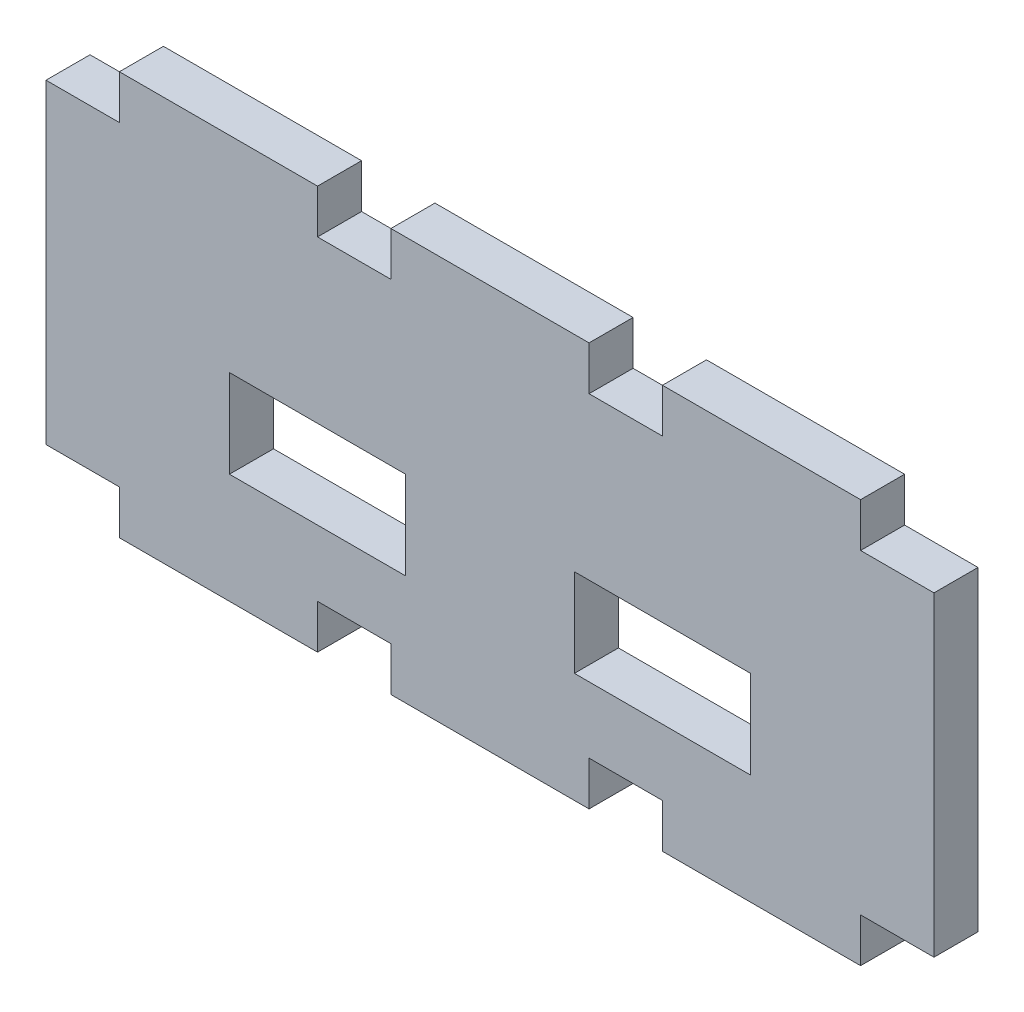
ISO-10303-21;
HEADER;
FILE_DESCRIPTION(('STEP AP214'),'2;1');
FILE_NAME('part.step','',(''),(''),'','','');
FILE_SCHEMA(('AUTOMOTIVE_DESIGN { 1 0 10303 214 1 1 1 1 }'));
ENDSEC;
DATA;
#1=APPLICATION_CONTEXT('core data for automotive mechanical design processes');
#2=APPLICATION_PROTOCOL_DEFINITION('international standard','automotive_design',2000,#1);
#3=PRODUCT_CONTEXT('',#1,'mechanical');
#4=PRODUCT('Part','Part','',(#3));
#5=PRODUCT_RELATED_PRODUCT_CATEGORY('part','',(#4));
#6=PRODUCT_DEFINITION_FORMATION('','',#4);
#7=PRODUCT_DEFINITION_CONTEXT('part definition',#1,'design');
#8=PRODUCT_DEFINITION('design','',#6,#7);
#9=PRODUCT_DEFINITION_SHAPE('','',#8);
#10=(LENGTH_UNIT() NAMED_UNIT(*) SI_UNIT(.MILLI.,.METRE.));
#11=(NAMED_UNIT(*) PLANE_ANGLE_UNIT() SI_UNIT($,.RADIAN.));
#12=(NAMED_UNIT(*) SI_UNIT($,.STERADIAN.) SOLID_ANGLE_UNIT());
#13=UNCERTAINTY_MEASURE_WITH_UNIT(LENGTH_MEASURE(1.E-05),#10,'distance_accuracy_value','');
#14=(GEOMETRIC_REPRESENTATION_CONTEXT(3) GLOBAL_UNCERTAINTY_ASSIGNED_CONTEXT((#13)) GLOBAL_UNIT_ASSIGNED_CONTEXT((#10,
#11,#12)) REPRESENTATION_CONTEXT('',''));
#15=CARTESIAN_POINT('',(0.,0.,0.));
#16=DIRECTION('',(0.,0.,1.));
#17=DIRECTION('',(1.,0.,0.));
#18=AXIS2_PLACEMENT_3D('',#15,#16,#17);
#19=CARTESIAN_POINT('',(0.,0.,6.));
#20=DIRECTION('',(0.,1.,0.));
#21=DIRECTION('',(-1.,0.,0.));
#22=AXIS2_PLACEMENT_3D('',#19,#20,#21);
#23=PLANE('',#22);
#24=DIRECTION('',(1.,0.,0.));
#25=VECTOR('',#24,1.);
#26=CARTESIAN_POINT('',(0.,0.,0.));
#27=LINE('',#26,#25);
#28=CARTESIAN_POINT('',(-74.,0.,0.));
#29=VERTEX_POINT('',#28);
#30=CARTESIAN_POINT('',(-47.,0.,0.));
#31=VERTEX_POINT('',#30);
#32=EDGE_CURVE('E538',#29,#31,#27,.T.);
#33=ORIENTED_EDGE('',*,*,#32,.T.);
#34=DIRECTION('',(0.,0.,1.));
#35=VECTOR('',#34,1.);
#36=CARTESIAN_POINT('',(-47.,0.,0.));
#37=LINE('',#36,#35);
#38=CARTESIAN_POINT('',(-47.,0.,6.));
#39=VERTEX_POINT('',#38);
#40=EDGE_CURVE('E366',#31,#39,#37,.T.);
#41=ORIENTED_EDGE('',*,*,#40,.T.);
#42=DIRECTION('',(1.,0.,0.));
#43=VECTOR('',#42,1.);
#44=CARTESIAN_POINT('',(0.,0.,6.));
#45=LINE('',#44,#43);
#46=CARTESIAN_POINT('',(-74.,0.,6.));
#47=VERTEX_POINT('',#46);
#48=EDGE_CURVE('E42',#47,#39,#45,.T.);
#49=ORIENTED_EDGE('',*,*,#48,.F.);
#50=DIRECTION('',(0.,0.,1.));
#51=VECTOR('',#50,1.);
#52=CARTESIAN_POINT('',(-74.,0.,0.));
#53=LINE('',#52,#51);
#54=EDGE_CURVE('E404',#29,#47,#53,.T.);
#55=ORIENTED_EDGE('',*,*,#54,.F.);
#56=EDGE_LOOP('',(#33,#41,#49,#55));
#57=FACE_BOUND('',#56,.T.);
#58=ADVANCED_FACE('F33',(#57),#23,.F.);
#59=CARTESIAN_POINT('',(-111.,0.,0.));
#60=VERTEX_POINT('',#59);
#61=CARTESIAN_POINT('',(-84.,0.,0.));
#62=VERTEX_POINT('',#61);
#63=EDGE_CURVE('E37',#60,#62,#27,.T.);
#64=ORIENTED_EDGE('',*,*,#63,.T.);
#65=DIRECTION('',(0.,0.,1.));
#66=VECTOR('',#65,1.);
#67=CARTESIAN_POINT('',(-84.,0.,0.));
#68=LINE('',#67,#66);
#69=CARTESIAN_POINT('',(-84.,0.,6.));
#70=VERTEX_POINT('',#69);
#71=EDGE_CURVE('E392',#62,#70,#68,.T.);
#72=ORIENTED_EDGE('',*,*,#71,.T.);
#73=CARTESIAN_POINT('',(-111.,0.,6.));
#74=VERTEX_POINT('',#73);
#75=EDGE_CURVE('E11',#74,#70,#45,.T.);
#76=ORIENTED_EDGE('',*,*,#75,.F.);
#77=DIRECTION('',(0.,0.,1.));
#78=VECTOR('',#77,1.);
#79=CARTESIAN_POINT('',(-111.,0.,0.));
#80=LINE('',#79,#78);
#81=EDGE_CURVE('E415',#60,#74,#80,.T.);
#82=ORIENTED_EDGE('',*,*,#81,.F.);
#83=EDGE_LOOP('',(#64,#72,#76,#82));
#84=FACE_BOUND('',#83,.T.);
#85=ADVANCED_FACE('F547',(#84),#23,.F.);
#86=CARTESIAN_POINT('',(0.,55.,6.));
#87=DIRECTION('',(0.,-1.,0.));
#88=DIRECTION('',(1.,0.,0.));
#89=AXIS2_PLACEMENT_3D('',#86,#87,#88);
#90=PLANE('',#89);
#91=DIRECTION('',(-1.,0.,0.));
#92=VECTOR('',#91,1.);
#93=CARTESIAN_POINT('',(0.,55.,6.));
#94=LINE('',#93,#92);
#95=CARTESIAN_POINT('',(-47.,55.,6.));
#96=VERTEX_POINT('',#95);
#97=CARTESIAN_POINT('',(-74.,55.,6.));
#98=VERTEX_POINT('',#97);
#99=EDGE_CURVE('E524',#96,#98,#94,.T.);
#100=ORIENTED_EDGE('',*,*,#99,.F.);
#101=DIRECTION('',(0.,0.,1.));
#102=VECTOR('',#101,1.);
#103=CARTESIAN_POINT('',(-47.,55.,0.));
#104=LINE('',#103,#102);
#105=CARTESIAN_POINT('',(-47.,55.,0.));
#106=VERTEX_POINT('',#105);
#107=EDGE_CURVE('E463',#106,#96,#104,.T.);
#108=ORIENTED_EDGE('',*,*,#107,.F.);
#109=DIRECTION('',(-1.,0.,0.));
#110=VECTOR('',#109,1.);
#111=CARTESIAN_POINT('',(0.,55.,0.));
#112=LINE('',#111,#110);
#113=CARTESIAN_POINT('',(-74.,55.,0.));
#114=VERTEX_POINT('',#113);
#115=EDGE_CURVE('E531',#106,#114,#112,.T.);
#116=ORIENTED_EDGE('',*,*,#115,.T.);
#117=DIRECTION('',(0.,0.,1.));
#118=VECTOR('',#117,1.);
#119=CARTESIAN_POINT('',(-74.,55.,0.));
#120=LINE('',#119,#118);
#121=EDGE_CURVE('E493',#114,#98,#120,.T.);
#122=ORIENTED_EDGE('',*,*,#121,.T.);
#123=EDGE_LOOP('',(#100,#108,#116,#122));
#124=FACE_BOUND('',#123,.T.);
#125=ADVANCED_FACE('F587',(#124),#90,.F.);
#126=CARTESIAN_POINT('',(-84.,55.,6.));
#127=VERTEX_POINT('',#126);
#128=CARTESIAN_POINT('',(-111.,55.,6.));
#129=VERTEX_POINT('',#128);
#130=EDGE_CURVE('E520',#127,#129,#94,.T.);
#131=ORIENTED_EDGE('',*,*,#130,.F.);
#132=DIRECTION('',(0.,0.,1.));
#133=VECTOR('',#132,1.);
#134=CARTESIAN_POINT('',(-84.,55.,0.));
#135=LINE('',#134,#133);
#136=CARTESIAN_POINT('',(-84.,55.,0.));
#137=VERTEX_POINT('',#136);
#138=EDGE_CURVE('E490',#137,#127,#135,.T.);
#139=ORIENTED_EDGE('',*,*,#138,.F.);
#140=CARTESIAN_POINT('',(-111.,55.,0.));
#141=VERTEX_POINT('',#140);
#142=EDGE_CURVE('E528',#137,#141,#112,.T.);
#143=ORIENTED_EDGE('',*,*,#142,.T.);
#144=DIRECTION('',(0.,0.,1.));
#145=VECTOR('',#144,1.);
#146=CARTESIAN_POINT('',(-111.,55.,0.));
#147=LINE('',#146,#145);
#148=EDGE_CURVE('E511',#141,#129,#147,.T.);
#149=ORIENTED_EDGE('',*,*,#148,.T.);
#150=EDGE_LOOP('',(#131,#139,#143,#149));
#151=FACE_BOUND('',#150,.T.);
#152=ADVANCED_FACE('F580',(#151),#90,.F.);
#153=CARTESIAN_POINT('',(0.,0.,6.));
#154=DIRECTION('',(-1.,0.,0.));
#155=DIRECTION('',(0.,-1.,0.));
#156=AXIS2_PLACEMENT_3D('',#153,#154,#155);
#157=PLANE('',#156);
#158=DIRECTION('',(0.,1.,0.));
#159=VECTOR('',#158,1.);
#160=CARTESIAN_POINT('',(0.,0.,6.));
#161=LINE('',#160,#159);
#162=CARTESIAN_POINT('',(0.,5.99999999999999,6.));
#163=VERTEX_POINT('',#162);
#164=CARTESIAN_POINT('',(0.,49.,6.));
#165=VERTEX_POINT('',#164);
#166=EDGE_CURVE('E518',#163,#165,#161,.T.);
#167=ORIENTED_EDGE('',*,*,#166,.F.);
#168=DIRECTION('',(0.,0.,1.));
#169=VECTOR('',#168,1.);
#170=CARTESIAN_POINT('',(0.,5.99999999999999,0.));
#171=LINE('',#170,#169);
#172=CARTESIAN_POINT('',(0.,5.99999999999999,0.));
#173=VERTEX_POINT('',#172);
#174=EDGE_CURVE('E345',#173,#163,#171,.T.);
#175=ORIENTED_EDGE('',*,*,#174,.F.);
#176=DIRECTION('',(0.,1.,0.));
#177=VECTOR('',#176,1.);
#178=CARTESIAN_POINT('',(0.,0.,0.));
#179=LINE('',#178,#177);
#180=CARTESIAN_POINT('',(0.,49.,0.));
#181=VERTEX_POINT('',#180);
#182=EDGE_CURVE('E514',#173,#181,#179,.T.);
#183=ORIENTED_EDGE('',*,*,#182,.T.);
#184=DIRECTION('',(0.,0.,1.));
#185=VECTOR('',#184,1.);
#186=CARTESIAN_POINT('',(0.,49.,0.));
#187=LINE('',#186,#185);
#188=EDGE_CURVE('E438',#181,#165,#187,.T.);
#189=ORIENTED_EDGE('',*,*,#188,.T.);
#190=EDGE_LOOP('',(#167,#175,#183,#189));
#191=FACE_BOUND('',#190,.T.);
#192=ADVANCED_FACE('F35',(#191),#157,.F.);
#193=CARTESIAN_POINT('',(-10.,55.,6.));
#194=VERTEX_POINT('',#193);
#195=CARTESIAN_POINT('',(-37.,55.,6.));
#196=VERTEX_POINT('',#195);
#197=EDGE_CURVE('E521',#194,#196,#94,.T.);
#198=ORIENTED_EDGE('',*,*,#197,.F.);
#199=DIRECTION('',(0.,0.,1.));
#200=VECTOR('',#199,1.);
#201=CARTESIAN_POINT('',(-10.,55.,0.));
#202=LINE('',#201,#200);
#203=CARTESIAN_POINT('',(-10.,55.,0.));
#204=VERTEX_POINT('',#203);
#205=EDGE_CURVE('E433',#204,#194,#202,.T.);
#206=ORIENTED_EDGE('',*,*,#205,.F.);
#207=CARTESIAN_POINT('',(-37.,55.,0.));
#208=VERTEX_POINT('',#207);
#209=EDGE_CURVE('E529',#204,#208,#112,.T.);
#210=ORIENTED_EDGE('',*,*,#209,.T.);
#211=DIRECTION('',(0.,0.,1.));
#212=VECTOR('',#211,1.);
#213=CARTESIAN_POINT('',(-37.,55.,0.));
#214=LINE('',#213,#212);
#215=EDGE_CURVE('E466',#208,#196,#214,.T.);
#216=ORIENTED_EDGE('',*,*,#215,.T.);
#217=EDGE_LOOP('',(#198,#206,#210,#216));
#218=FACE_BOUND('',#217,.T.);
#219=ADVANCED_FACE('F611',(#218),#90,.F.);
#220=CARTESIAN_POINT('',(-121.,0.,6.));
#221=DIRECTION('',(1.,0.,0.));
#222=DIRECTION('',(0.,0.,-1.));
#223=AXIS2_PLACEMENT_3D('',#220,#221,#222);
#224=PLANE('',#223);
#225=DIRECTION('',(0.,-1.,0.));
#226=VECTOR('',#225,1.);
#227=CARTESIAN_POINT('',(-121.,0.,0.));
#228=LINE('',#227,#226);
#229=CARTESIAN_POINT('',(-121.,49.,0.));
#230=VERTEX_POINT('',#229);
#231=CARTESIAN_POINT('',(-121.,6.,0.));
#232=VERTEX_POINT('',#231);
#233=EDGE_CURVE('E530',#230,#232,#228,.T.);
#234=ORIENTED_EDGE('',*,*,#233,.T.);
#235=DIRECTION('',(0.,0.,1.));
#236=VECTOR('',#235,1.);
#237=CARTESIAN_POINT('',(-121.,6.,0.));
#238=LINE('',#237,#236);
#239=CARTESIAN_POINT('',(-121.,6.,6.));
#240=VERTEX_POINT('',#239);
#241=EDGE_CURVE('E419',#232,#240,#238,.T.);
#242=ORIENTED_EDGE('',*,*,#241,.T.);
#243=DIRECTION('',(0.,-1.,0.));
#244=VECTOR('',#243,1.);
#245=CARTESIAN_POINT('',(-121.,0.,6.));
#246=LINE('',#245,#244);
#247=CARTESIAN_POINT('',(-121.,49.,6.));
#248=VERTEX_POINT('',#247);
#249=EDGE_CURVE('E523',#248,#240,#246,.T.);
#250=ORIENTED_EDGE('',*,*,#249,.F.);
#251=DIRECTION('',(0.,0.,1.));
#252=VECTOR('',#251,1.);
#253=CARTESIAN_POINT('',(-121.,49.,0.));
#254=LINE('',#253,#252);
#255=EDGE_CURVE('E506',#230,#248,#254,.T.);
#256=ORIENTED_EDGE('',*,*,#255,.F.);
#257=EDGE_LOOP('',(#234,#242,#250,#256));
#258=FACE_BOUND('',#257,.T.);
#259=ADVANCED_FACE('F572',(#258),#224,.F.);
#260=CARTESIAN_POINT('',(-37.,0.,0.));
#261=VERTEX_POINT('',#260);
#262=CARTESIAN_POINT('',(-10.,0.,0.));
#263=VERTEX_POINT('',#262);
#264=EDGE_CURVE('E533',#261,#263,#27,.T.);
#265=ORIENTED_EDGE('',*,*,#264,.T.);
#266=DIRECTION('',(0.,0.,1.));
#267=VECTOR('',#266,1.);
#268=CARTESIAN_POINT('',(-10.,0.,0.));
#269=LINE('',#268,#267);
#270=CARTESIAN_POINT('',(-10.,0.,6.));
#271=VERTEX_POINT('',#270);
#272=EDGE_CURVE('E349',#263,#271,#269,.T.);
#273=ORIENTED_EDGE('',*,*,#272,.T.);
#274=CARTESIAN_POINT('',(-37.,0.,6.));
#275=VERTEX_POINT('',#274);
#276=EDGE_CURVE('E44',#275,#271,#45,.T.);
#277=ORIENTED_EDGE('',*,*,#276,.F.);
#278=DIRECTION('',(0.,0.,1.));
#279=VECTOR('',#278,1.);
#280=CARTESIAN_POINT('',(-37.,0.,0.));
#281=LINE('',#280,#279);
#282=EDGE_CURVE('E378',#261,#275,#281,.T.);
#283=ORIENTED_EDGE('',*,*,#282,.F.);
#284=EDGE_LOOP('',(#265,#273,#277,#283));
#285=FACE_BOUND('',#284,.T.);
#286=ADVANCED_FACE('F633',(#285),#23,.F.);
#287=CARTESIAN_POINT('',(0.,0.,6.));
#288=DIRECTION('',(0.,0.,1.));
#289=DIRECTION('',(1.,0.,0.));
#290=AXIS2_PLACEMENT_3D('',#287,#288,#289);
#291=PLANE('',#290);
#292=DIRECTION('',(0.,-1.,0.));
#293=VECTOR('',#292,1.);
#294=CARTESIAN_POINT('',(-49.,27.,6.));
#295=LINE('',#294,#293);
#296=CARTESIAN_POINT('',(-49.,27.,6.));
#297=VERTEX_POINT('',#296);
#298=CARTESIAN_POINT('',(-49.,15.,6.));
#299=VERTEX_POINT('',#298);
#300=EDGE_CURVE('E51',#297,#299,#295,.T.);
#301=ORIENTED_EDGE('',*,*,#300,.F.);
#302=DIRECTION('',(-1.,0.,0.));
#303=VECTOR('',#302,1.);
#304=CARTESIAN_POINT('',(-49.,27.,6.));
#305=LINE('',#304,#303);
#306=CARTESIAN_POINT('',(-25.,27.,6.));
#307=VERTEX_POINT('',#306);
#308=EDGE_CURVE('E287',#307,#297,#305,.T.);
#309=ORIENTED_EDGE('',*,*,#308,.F.);
#310=DIRECTION('',(0.,1.,0.));
#311=VECTOR('',#310,1.);
#312=CARTESIAN_POINT('',(-25.,27.,6.));
#313=LINE('',#312,#311);
#314=CARTESIAN_POINT('',(-25.,15.,6.));
#315=VERTEX_POINT('',#314);
#316=EDGE_CURVE('E290',#315,#307,#313,.T.);
#317=ORIENTED_EDGE('',*,*,#316,.F.);
#318=DIRECTION('',(1.,0.,0.));
#319=VECTOR('',#318,1.);
#320=CARTESIAN_POINT('',(-49.,15.,6.));
#321=LINE('',#320,#319);
#322=EDGE_CURVE('E296',#299,#315,#321,.T.);
#323=ORIENTED_EDGE('',*,*,#322,.F.);
#324=EDGE_LOOP('',(#301,#309,#317,#323));
#325=FACE_BOUND('',#324,.T.);
#326=DIRECTION('',(0.,-1.,0.));
#327=VECTOR('',#326,1.);
#328=CARTESIAN_POINT('',(-96.,27.,6.));
#329=LINE('',#328,#327);
#330=CARTESIAN_POINT('',(-96.,27.,6.));
#331=VERTEX_POINT('',#330);
#332=CARTESIAN_POINT('',(-96.,15.,6.));
#333=VERTEX_POINT('',#332);
#334=EDGE_CURVE('E302',#331,#333,#329,.T.);
#335=ORIENTED_EDGE('',*,*,#334,.F.);
#336=DIRECTION('',(-1.,0.,0.));
#337=VECTOR('',#336,1.);
#338=CARTESIAN_POINT('',(-96.,27.,6.));
#339=LINE('',#338,#337);
#340=CARTESIAN_POINT('',(-72.,27.,6.));
#341=VERTEX_POINT('',#340);
#342=EDGE_CURVE('E310',#341,#331,#339,.T.);
#343=ORIENTED_EDGE('',*,*,#342,.F.);
#344=DIRECTION('',(0.,1.,0.));
#345=VECTOR('',#344,1.);
#346=CARTESIAN_POINT('',(-72.,27.,6.));
#347=LINE('',#346,#345);
#348=CARTESIAN_POINT('',(-72.,15.,6.));
#349=VERTEX_POINT('',#348);
#350=EDGE_CURVE('E324',#349,#341,#347,.T.);
#351=ORIENTED_EDGE('',*,*,#350,.F.);
#352=DIRECTION('',(1.,0.,0.));
#353=VECTOR('',#352,1.);
#354=CARTESIAN_POINT('',(-96.,15.,6.));
#355=LINE('',#354,#353);
#356=EDGE_CURVE('E321',#333,#349,#355,.T.);
#357=ORIENTED_EDGE('',*,*,#356,.F.);
#358=EDGE_LOOP('',(#335,#343,#351,#357));
#359=FACE_BOUND('',#358,.T.);
#360=DIRECTION('',(0.,-1.,0.));
#361=VECTOR('',#360,1.);
#362=CARTESIAN_POINT('',(-10.,0.,6.));
#363=LINE('',#362,#361);
#364=CARTESIAN_POINT('',(-10.,5.99999999999999,6.));
#365=VERTEX_POINT('',#364);
#366=EDGE_CURVE('E342',#365,#271,#363,.T.);
#367=ORIENTED_EDGE('',*,*,#366,.F.);
#368=DIRECTION('',(-1.,0.,0.));
#369=VECTOR('',#368,1.);
#370=CARTESIAN_POINT('',(0.,5.99999999999999,6.));
#371=LINE('',#370,#369);
#372=EDGE_CURVE('E331',#163,#365,#371,.T.);
#373=ORIENTED_EDGE('',*,*,#372,.F.);
#374=ORIENTED_EDGE('',*,*,#166,.T.);
#375=DIRECTION('',(1.,0.,0.));
#376=VECTOR('',#375,1.);
#377=CARTESIAN_POINT('',(0.,49.,6.));
#378=LINE('',#377,#376);
#379=CARTESIAN_POINT('',(-10.,49.,6.));
#380=VERTEX_POINT('',#379);
#381=EDGE_CURVE('E430',#380,#165,#378,.T.);
#382=ORIENTED_EDGE('',*,*,#381,.F.);
#383=DIRECTION('',(0.,-1.,0.));
#384=VECTOR('',#383,1.);
#385=CARTESIAN_POINT('',(-10.,55.,6.));
#386=LINE('',#385,#384);
#387=EDGE_CURVE('E422',#194,#380,#386,.T.);
#388=ORIENTED_EDGE('',*,*,#387,.F.);
#389=ORIENTED_EDGE('',*,*,#197,.T.);
#390=DIRECTION('',(0.,1.,0.));
#391=VECTOR('',#390,1.);
#392=CARTESIAN_POINT('',(-37.,55.,6.));
#393=LINE('',#392,#391);
#394=CARTESIAN_POINT('',(-37.,49.,6.));
#395=VERTEX_POINT('',#394);
#396=EDGE_CURVE('E449',#395,#196,#393,.T.);
#397=ORIENTED_EDGE('',*,*,#396,.F.);
#398=DIRECTION('',(1.,0.,0.));
#399=VECTOR('',#398,1.);
#400=CARTESIAN_POINT('',(-47.,49.,6.));
#401=LINE('',#400,#399);
#402=CARTESIAN_POINT('',(-47.,49.,6.));
#403=VERTEX_POINT('',#402);
#404=EDGE_CURVE('E458',#403,#395,#401,.T.);
#405=ORIENTED_EDGE('',*,*,#404,.F.);
#406=DIRECTION('',(0.,-1.,0.));
#407=VECTOR('',#406,1.);
#408=CARTESIAN_POINT('',(-47.,55.,6.));
#409=LINE('',#408,#407);
#410=EDGE_CURVE('E441',#96,#403,#409,.T.);
#411=ORIENTED_EDGE('',*,*,#410,.F.);
#412=ORIENTED_EDGE('',*,*,#99,.T.);
#413=DIRECTION('',(0.,1.,0.));
#414=VECTOR('',#413,1.);
#415=CARTESIAN_POINT('',(-74.,55.,6.));
#416=LINE('',#415,#414);
#417=CARTESIAN_POINT('',(-74.,49.,6.));
#418=VERTEX_POINT('',#417);
#419=EDGE_CURVE('E476',#418,#98,#416,.T.);
#420=ORIENTED_EDGE('',*,*,#419,.F.);
#421=DIRECTION('',(1.,0.,0.));
#422=VECTOR('',#421,1.);
#423=CARTESIAN_POINT('',(-84.,49.,6.));
#424=LINE('',#423,#422);
#425=CARTESIAN_POINT('',(-84.,49.,6.));
#426=VERTEX_POINT('',#425);
#427=EDGE_CURVE('E485',#426,#418,#424,.T.);
#428=ORIENTED_EDGE('',*,*,#427,.F.);
#429=DIRECTION('',(0.,-1.,0.));
#430=VECTOR('',#429,1.);
#431=CARTESIAN_POINT('',(-84.,55.,6.));
#432=LINE('',#431,#430);
#433=EDGE_CURVE('E465',#127,#426,#432,.T.);
#434=ORIENTED_EDGE('',*,*,#433,.F.);
#435=ORIENTED_EDGE('',*,*,#130,.T.);
#436=DIRECTION('',(0.,1.,0.));
#437=VECTOR('',#436,1.);
#438=CARTESIAN_POINT('',(-111.,55.,6.));
#439=LINE('',#438,#437);
#440=CARTESIAN_POINT('',(-111.,49.,6.));
#441=VERTEX_POINT('',#440);
#442=EDGE_CURVE('E503',#441,#129,#439,.T.);
#443=ORIENTED_EDGE('',*,*,#442,.F.);
#444=DIRECTION('',(1.,0.,0.));
#445=VECTOR('',#444,1.);
#446=CARTESIAN_POINT('',(-121.,49.,6.));
#447=LINE('',#446,#445);
#448=EDGE_CURVE('E492',#248,#441,#447,.T.);
#449=ORIENTED_EDGE('',*,*,#448,.F.);
#450=ORIENTED_EDGE('',*,*,#249,.T.);
#451=DIRECTION('',(-1.,0.,0.));
#452=VECTOR('',#451,1.);
#453=CARTESIAN_POINT('',(-121.,6.,6.));
#454=LINE('',#453,#452);
#455=CARTESIAN_POINT('',(-111.,6.,6.));
#456=VERTEX_POINT('',#455);
#457=EDGE_CURVE('E412',#456,#240,#454,.T.);
#458=ORIENTED_EDGE('',*,*,#457,.F.);
#459=DIRECTION('',(0.,1.,0.));
#460=VECTOR('',#459,1.);
#461=CARTESIAN_POINT('',(-111.,0.,6.));
#462=LINE('',#461,#460);
#463=EDGE_CURVE('E401',#74,#456,#462,.T.);
#464=ORIENTED_EDGE('',*,*,#463,.F.);
#465=ORIENTED_EDGE('',*,*,#75,.T.);
#466=DIRECTION('',(0.,-1.,0.));
#467=VECTOR('',#466,1.);
#468=CARTESIAN_POINT('',(-84.,0.,6.));
#469=LINE('',#468,#467);
#470=CARTESIAN_POINT('',(-84.,5.99999999999999,6.));
#471=VERTEX_POINT('',#470);
#472=EDGE_CURVE('E375',#471,#70,#469,.T.);
#473=ORIENTED_EDGE('',*,*,#472,.F.);
#474=DIRECTION('',(-1.,0.,0.));
#475=VECTOR('',#474,1.);
#476=CARTESIAN_POINT('',(-84.,5.99999999999999,6.));
#477=LINE('',#476,#475);
#478=CARTESIAN_POINT('',(-74.,5.99999999999999,6.));
#479=VERTEX_POINT('',#478);
#480=EDGE_CURVE('E386',#479,#471,#477,.T.);
#481=ORIENTED_EDGE('',*,*,#480,.F.);
#482=DIRECTION('',(0.,1.,0.));
#483=VECTOR('',#482,1.);
#484=CARTESIAN_POINT('',(-74.,0.,6.));
#485=LINE('',#484,#483);
#486=EDGE_CURVE('E394',#47,#479,#485,.T.);
#487=ORIENTED_EDGE('',*,*,#486,.F.);
#488=ORIENTED_EDGE('',*,*,#48,.T.);
#489=DIRECTION('',(0.,-1.,0.));
#490=VECTOR('',#489,1.);
#491=CARTESIAN_POINT('',(-47.,0.,6.));
#492=LINE('',#491,#490);
#493=CARTESIAN_POINT('',(-47.,5.99999999999999,6.));
#494=VERTEX_POINT('',#493);
#495=EDGE_CURVE('E352',#494,#39,#492,.T.);
#496=ORIENTED_EDGE('',*,*,#495,.F.);
#497=DIRECTION('',(-1.,0.,0.));
#498=VECTOR('',#497,1.);
#499=CARTESIAN_POINT('',(-47.,5.99999999999999,6.));
#500=LINE('',#499,#498);
#501=CARTESIAN_POINT('',(-37.,5.99999999999999,6.));
#502=VERTEX_POINT('',#501);
#503=EDGE_CURVE('E360',#502,#494,#500,.T.);
#504=ORIENTED_EDGE('',*,*,#503,.F.);
#505=DIRECTION('',(0.,1.,0.));
#506=VECTOR('',#505,1.);
#507=CARTESIAN_POINT('',(-37.,0.,6.));
#508=LINE('',#507,#506);
#509=EDGE_CURVE('E368',#275,#502,#508,.T.);
#510=ORIENTED_EDGE('',*,*,#509,.F.);
#511=ORIENTED_EDGE('',*,*,#276,.T.);
#512=EDGE_LOOP('',(#367,#373,#374,#382,#388,#389,#397,#405,#411,#412,#420,#428,#434,#435,#443,
#449,#450,#458,#464,#465,#473,#481,#487,#488,#496,#504,#510,#511));
#513=FACE_BOUND('',#512,.T.);
#514=ADVANCED_FACE('F557',(#325,#359,#513),#291,.T.);
#515=CARTESIAN_POINT('',(0.,0.,0.));
#516=DIRECTION('',(0.,0.,1.));
#517=DIRECTION('',(1.,0.,0.));
#518=AXIS2_PLACEMENT_3D('',#515,#516,#517);
#519=PLANE('',#518);
#520=DIRECTION('',(-1.,0.,0.));
#521=VECTOR('',#520,1.);
#522=CARTESIAN_POINT('',(-49.,27.,0.));
#523=LINE('',#522,#521);
#524=CARTESIAN_POINT('',(-25.,27.,0.));
#525=VERTEX_POINT('',#524);
#526=CARTESIAN_POINT('',(-49.,27.,0.));
#527=VERTEX_POINT('',#526);
#528=EDGE_CURVE('E277',#525,#527,#523,.T.);
#529=ORIENTED_EDGE('',*,*,#528,.T.);
#530=DIRECTION('',(0.,-1.,0.));
#531=VECTOR('',#530,1.);
#532=CARTESIAN_POINT('',(-49.,27.,0.));
#533=LINE('',#532,#531);
#534=CARTESIAN_POINT('',(-49.,15.,0.));
#535=VERTEX_POINT('',#534);
#536=EDGE_CURVE('E271',#527,#535,#533,.T.);
#537=ORIENTED_EDGE('',*,*,#536,.T.);
#538=DIRECTION('',(1.,0.,0.));
#539=VECTOR('',#538,1.);
#540=CARTESIAN_POINT('',(-49.,15.,0.));
#541=LINE('',#540,#539);
#542=CARTESIAN_POINT('',(-25.,15.,0.));
#543=VERTEX_POINT('',#542);
#544=EDGE_CURVE('E280',#535,#543,#541,.T.);
#545=ORIENTED_EDGE('',*,*,#544,.T.);
#546=DIRECTION('',(0.,1.,0.));
#547=VECTOR('',#546,1.);
#548=CARTESIAN_POINT('',(-25.,27.,0.));
#549=LINE('',#548,#547);
#550=EDGE_CURVE('E59',#543,#525,#549,.T.);
#551=ORIENTED_EDGE('',*,*,#550,.T.);
#552=EDGE_LOOP('',(#529,#537,#545,#551));
#553=FACE_BOUND('',#552,.T.);
#554=DIRECTION('',(-1.,0.,0.));
#555=VECTOR('',#554,1.);
#556=CARTESIAN_POINT('',(-96.,27.,0.));
#557=LINE('',#556,#555);
#558=CARTESIAN_POINT('',(-72.,27.,0.));
#559=VERTEX_POINT('',#558);
#560=CARTESIAN_POINT('',(-96.,27.,0.));
#561=VERTEX_POINT('',#560);
#562=EDGE_CURVE('E316',#559,#561,#557,.T.);
#563=ORIENTED_EDGE('',*,*,#562,.T.);
#564=DIRECTION('',(0.,-1.,0.));
#565=VECTOR('',#564,1.);
#566=CARTESIAN_POINT('',(-96.,27.,0.));
#567=LINE('',#566,#565);
#568=CARTESIAN_POINT('',(-96.,15.,0.));
#569=VERTEX_POINT('',#568);
#570=EDGE_CURVE('E306',#561,#569,#567,.T.);
#571=ORIENTED_EDGE('',*,*,#570,.T.);
#572=DIRECTION('',(1.,0.,0.));
#573=VECTOR('',#572,1.);
#574=CARTESIAN_POINT('',(-96.,15.,0.));
#575=LINE('',#574,#573);
#576=CARTESIAN_POINT('',(-72.,15.,0.));
#577=VERTEX_POINT('',#576);
#578=EDGE_CURVE('E309',#569,#577,#575,.T.);
#579=ORIENTED_EDGE('',*,*,#578,.T.);
#580=DIRECTION('',(0.,1.,0.));
#581=VECTOR('',#580,1.);
#582=CARTESIAN_POINT('',(-72.,27.,0.));
#583=LINE('',#582,#581);
#584=EDGE_CURVE('E313',#577,#559,#583,.T.);
#585=ORIENTED_EDGE('',*,*,#584,.T.);
#586=EDGE_LOOP('',(#563,#571,#579,#585));
#587=FACE_BOUND('',#586,.T.);
#588=DIRECTION('',(-1.,0.,0.));
#589=VECTOR('',#588,1.);
#590=CARTESIAN_POINT('',(0.,5.99999999999999,0.));
#591=LINE('',#590,#589);
#592=CARTESIAN_POINT('',(-10.,5.99999999999999,0.));
#593=VERTEX_POINT('',#592);
#594=EDGE_CURVE('E338',#173,#593,#591,.T.);
#595=ORIENTED_EDGE('',*,*,#594,.T.);
#596=DIRECTION('',(0.,-1.,0.));
#597=VECTOR('',#596,1.);
#598=CARTESIAN_POINT('',(-10.,0.,0.));
#599=LINE('',#598,#597);
#600=EDGE_CURVE('E341',#593,#263,#599,.T.);
#601=ORIENTED_EDGE('',*,*,#600,.T.);
#602=ORIENTED_EDGE('',*,*,#264,.F.);
#603=DIRECTION('',(0.,1.,0.));
#604=VECTOR('',#603,1.);
#605=CARTESIAN_POINT('',(-37.,0.,0.));
#606=LINE('',#605,#604);
#607=CARTESIAN_POINT('',(-37.,5.99999999999999,0.));
#608=VERTEX_POINT('',#607);
#609=EDGE_CURVE('E359',#261,#608,#606,.T.);
#610=ORIENTED_EDGE('',*,*,#609,.T.);
#611=DIRECTION('',(-1.,0.,0.));
#612=VECTOR('',#611,1.);
#613=CARTESIAN_POINT('',(-47.,5.99999999999999,0.));
#614=LINE('',#613,#612);
#615=CARTESIAN_POINT('',(-47.,5.99999999999999,0.));
#616=VERTEX_POINT('',#615);
#617=EDGE_CURVE('E363',#608,#616,#614,.T.);
#618=ORIENTED_EDGE('',*,*,#617,.T.);
#619=DIRECTION('',(0.,-1.,0.));
#620=VECTOR('',#619,1.);
#621=CARTESIAN_POINT('',(-47.,0.,0.));
#622=LINE('',#621,#620);
#623=EDGE_CURVE('E356',#616,#31,#622,.T.);
#624=ORIENTED_EDGE('',*,*,#623,.T.);
#625=ORIENTED_EDGE('',*,*,#32,.F.);
#626=DIRECTION('',(0.,1.,0.));
#627=VECTOR('',#626,1.);
#628=CARTESIAN_POINT('',(-74.,0.,0.));
#629=LINE('',#628,#627);
#630=CARTESIAN_POINT('',(-74.,5.99999999999999,0.));
#631=VERTEX_POINT('',#630);
#632=EDGE_CURVE('E385',#29,#631,#629,.T.);
#633=ORIENTED_EDGE('',*,*,#632,.T.);
#634=DIRECTION('',(-1.,0.,0.));
#635=VECTOR('',#634,1.);
#636=CARTESIAN_POINT('',(-84.,5.99999999999999,0.));
#637=LINE('',#636,#635);
#638=CARTESIAN_POINT('',(-84.,5.99999999999999,0.));
#639=VERTEX_POINT('',#638);
#640=EDGE_CURVE('E389',#631,#639,#637,.T.);
#641=ORIENTED_EDGE('',*,*,#640,.T.);
#642=DIRECTION('',(0.,-1.,0.));
#643=VECTOR('',#642,1.);
#644=CARTESIAN_POINT('',(-84.,0.,0.));
#645=LINE('',#644,#643);
#646=EDGE_CURVE('E382',#639,#62,#645,.T.);
#647=ORIENTED_EDGE('',*,*,#646,.T.);
#648=ORIENTED_EDGE('',*,*,#63,.F.);
#649=DIRECTION('',(0.,1.,0.));
#650=VECTOR('',#649,1.);
#651=CARTESIAN_POINT('',(-111.,0.,0.));
#652=LINE('',#651,#650);
#653=CARTESIAN_POINT('',(-111.,6.,0.));
#654=VERTEX_POINT('',#653);
#655=EDGE_CURVE('E408',#60,#654,#652,.T.);
#656=ORIENTED_EDGE('',*,*,#655,.T.);
#657=DIRECTION('',(-1.,0.,0.));
#658=VECTOR('',#657,1.);
#659=CARTESIAN_POINT('',(-121.,6.,0.));
#660=LINE('',#659,#658);
#661=EDGE_CURVE('E411',#654,#232,#660,.T.);
#662=ORIENTED_EDGE('',*,*,#661,.T.);
#663=ORIENTED_EDGE('',*,*,#233,.F.);
#664=DIRECTION('',(1.,0.,0.));
#665=VECTOR('',#664,1.);
#666=CARTESIAN_POINT('',(-121.,49.,0.));
#667=LINE('',#666,#665);
#668=CARTESIAN_POINT('',(-111.,49.,0.));
#669=VERTEX_POINT('',#668);
#670=EDGE_CURVE('E499',#230,#669,#667,.T.);
#671=ORIENTED_EDGE('',*,*,#670,.T.);
#672=DIRECTION('',(0.,1.,0.));
#673=VECTOR('',#672,1.);
#674=CARTESIAN_POINT('',(-111.,55.,0.));
#675=LINE('',#674,#673);
#676=EDGE_CURVE('E502',#669,#141,#675,.T.);
#677=ORIENTED_EDGE('',*,*,#676,.T.);
#678=ORIENTED_EDGE('',*,*,#142,.F.);
#679=DIRECTION('',(0.,-1.,0.));
#680=VECTOR('',#679,1.);
#681=CARTESIAN_POINT('',(-84.,55.,0.));
#682=LINE('',#681,#680);
#683=CARTESIAN_POINT('',(-84.,49.,0.));
#684=VERTEX_POINT('',#683);
#685=EDGE_CURVE('E472',#137,#684,#682,.T.);
#686=ORIENTED_EDGE('',*,*,#685,.T.);
#687=DIRECTION('',(1.,0.,0.));
#688=VECTOR('',#687,1.);
#689=CARTESIAN_POINT('',(-84.,49.,0.));
#690=LINE('',#689,#688);
#691=CARTESIAN_POINT('',(-74.,49.,0.));
#692=VERTEX_POINT('',#691);
#693=EDGE_CURVE('E475',#684,#692,#690,.T.);
#694=ORIENTED_EDGE('',*,*,#693,.T.);
#695=DIRECTION('',(0.,1.,0.));
#696=VECTOR('',#695,1.);
#697=CARTESIAN_POINT('',(-74.,55.,0.));
#698=LINE('',#697,#696);
#699=EDGE_CURVE('E479',#692,#114,#698,.T.);
#700=ORIENTED_EDGE('',*,*,#699,.T.);
#701=ORIENTED_EDGE('',*,*,#115,.F.);
#702=DIRECTION('',(0.,-1.,0.));
#703=VECTOR('',#702,1.);
#704=CARTESIAN_POINT('',(-47.,55.,0.));
#705=LINE('',#704,#703);
#706=CARTESIAN_POINT('',(-47.,49.,0.));
#707=VERTEX_POINT('',#706);
#708=EDGE_CURVE('E445',#106,#707,#705,.T.);
#709=ORIENTED_EDGE('',*,*,#708,.T.);
#710=DIRECTION('',(1.,0.,0.));
#711=VECTOR('',#710,1.);
#712=CARTESIAN_POINT('',(-47.,49.,0.));
#713=LINE('',#712,#711);
#714=CARTESIAN_POINT('',(-37.,49.,0.));
#715=VERTEX_POINT('',#714);
#716=EDGE_CURVE('E448',#707,#715,#713,.T.);
#717=ORIENTED_EDGE('',*,*,#716,.T.);
#718=DIRECTION('',(0.,1.,0.));
#719=VECTOR('',#718,1.);
#720=CARTESIAN_POINT('',(-37.,55.,0.));
#721=LINE('',#720,#719);
#722=EDGE_CURVE('E452',#715,#208,#721,.T.);
#723=ORIENTED_EDGE('',*,*,#722,.T.);
#724=ORIENTED_EDGE('',*,*,#209,.F.);
#725=DIRECTION('',(0.,-1.,0.));
#726=VECTOR('',#725,1.);
#727=CARTESIAN_POINT('',(-10.,55.,0.));
#728=LINE('',#727,#726);
#729=CARTESIAN_POINT('',(-10.,49.,0.));
#730=VERTEX_POINT('',#729);
#731=EDGE_CURVE('E426',#204,#730,#728,.T.);
#732=ORIENTED_EDGE('',*,*,#731,.T.);
#733=DIRECTION('',(1.,0.,0.));
#734=VECTOR('',#733,1.);
#735=CARTESIAN_POINT('',(0.,49.,0.));
#736=LINE('',#735,#734);
#737=EDGE_CURVE('E429',#730,#181,#736,.T.);
#738=ORIENTED_EDGE('',*,*,#737,.T.);
#739=ORIENTED_EDGE('',*,*,#182,.F.);
#740=EDGE_LOOP('',(#595,#601,#602,#610,#618,#624,#625,#633,#641,#647,#648,#656,#662,#663,#671,
#677,#678,#686,#694,#700,#701,#709,#717,#723,#724,#732,#738,#739));
#741=FACE_BOUND('',#740,.T.);
#742=ADVANCED_FACE('F284',(#553,#587,#741),#519,.F.);
#743=CARTESIAN_POINT('',(-111.,55.,0.));
#744=DIRECTION('',(1.,0.,0.));
#745=DIRECTION('',(0.,1.,0.));
#746=AXIS2_PLACEMENT_3D('',#743,#744,#745);
#747=PLANE('',#746);
#748=ORIENTED_EDGE('',*,*,#442,.T.);
#749=ORIENTED_EDGE('',*,*,#148,.F.);
#750=ORIENTED_EDGE('',*,*,#676,.F.);
#751=DIRECTION('',(0.,0.,1.));
#752=VECTOR('',#751,1.);
#753=CARTESIAN_POINT('',(-111.,49.,0.));
#754=LINE('',#753,#752);
#755=EDGE_CURVE('E515',#669,#441,#754,.T.);
#756=ORIENTED_EDGE('',*,*,#755,.T.);
#757=EDGE_LOOP('',(#748,#749,#750,#756));
#758=FACE_BOUND('',#757,.T.);
#759=ADVANCED_FACE('F578',(#758),#747,.F.);
#760=CARTESIAN_POINT('',(-121.,49.,0.));
#761=DIRECTION('',(0.,-1.,0.));
#762=DIRECTION('',(1.,0.,0.));
#763=AXIS2_PLACEMENT_3D('',#760,#761,#762);
#764=PLANE('',#763);
#765=ORIENTED_EDGE('',*,*,#448,.T.);
#766=ORIENTED_EDGE('',*,*,#755,.F.);
#767=ORIENTED_EDGE('',*,*,#670,.F.);
#768=ORIENTED_EDGE('',*,*,#255,.T.);
#769=EDGE_LOOP('',(#765,#766,#767,#768));
#770=FACE_BOUND('',#769,.T.);
#771=ADVANCED_FACE('F569',(#770),#764,.F.);
#772=CARTESIAN_POINT('',(-84.,55.,0.));
#773=DIRECTION('',(-1.,0.,0.));
#774=DIRECTION('',(0.,-1.,0.));
#775=AXIS2_PLACEMENT_3D('',#772,#773,#774);
#776=PLANE('',#775);
#777=ORIENTED_EDGE('',*,*,#433,.T.);
#778=DIRECTION('',(0.,0.,1.));
#779=VECTOR('',#778,1.);
#780=CARTESIAN_POINT('',(-84.,49.,0.));
#781=LINE('',#780,#779);
#782=EDGE_CURVE('E482',#684,#426,#781,.T.);
#783=ORIENTED_EDGE('',*,*,#782,.F.);
#784=ORIENTED_EDGE('',*,*,#685,.F.);
#785=ORIENTED_EDGE('',*,*,#138,.T.);
#786=EDGE_LOOP('',(#777,#783,#784,#785));
#787=FACE_BOUND('',#786,.T.);
#788=ADVANCED_FACE('F721',(#787),#776,.F.);
#789=CARTESIAN_POINT('',(-74.,55.,0.));
#790=DIRECTION('',(1.,0.,0.));
#791=DIRECTION('',(0.,0.,-1.));
#792=AXIS2_PLACEMENT_3D('',#789,#790,#791);
#793=PLANE('',#792);
#794=ORIENTED_EDGE('',*,*,#419,.T.);
#795=ORIENTED_EDGE('',*,*,#121,.F.);
#796=ORIENTED_EDGE('',*,*,#699,.F.);
#797=DIRECTION('',(0.,0.,1.));
#798=VECTOR('',#797,1.);
#799=CARTESIAN_POINT('',(-74.,49.,0.));
#800=LINE('',#799,#798);
#801=EDGE_CURVE('E496',#692,#418,#800,.T.);
#802=ORIENTED_EDGE('',*,*,#801,.T.);
#803=EDGE_LOOP('',(#794,#795,#796,#802));
#804=FACE_BOUND('',#803,.T.);
#805=ADVANCED_FACE('F589',(#804),#793,.F.);
#806=CARTESIAN_POINT('',(-84.,49.,0.));
#807=DIRECTION('',(0.,-1.,0.));
#808=DIRECTION('',(0.,0.,-1.));
#809=AXIS2_PLACEMENT_3D('',#806,#807,#808);
#810=PLANE('',#809);
#811=ORIENTED_EDGE('',*,*,#427,.T.);
#812=ORIENTED_EDGE('',*,*,#801,.F.);
#813=ORIENTED_EDGE('',*,*,#693,.F.);
#814=ORIENTED_EDGE('',*,*,#782,.T.);
#815=EDGE_LOOP('',(#811,#812,#813,#814));
#816=FACE_BOUND('',#815,.T.);
#817=ADVANCED_FACE('F594',(#816),#810,.F.);
#818=CARTESIAN_POINT('',(-47.,55.,0.));
#819=DIRECTION('',(-1.,0.,0.));
#820=DIRECTION('',(0.,0.,1.));
#821=AXIS2_PLACEMENT_3D('',#818,#819,#820);
#822=PLANE('',#821);
#823=ORIENTED_EDGE('',*,*,#410,.T.);
#824=DIRECTION('',(0.,0.,1.));
#825=VECTOR('',#824,1.);
#826=CARTESIAN_POINT('',(-47.,49.,0.));
#827=LINE('',#826,#825);
#828=EDGE_CURVE('E455',#707,#403,#827,.T.);
#829=ORIENTED_EDGE('',*,*,#828,.F.);
#830=ORIENTED_EDGE('',*,*,#708,.F.);
#831=ORIENTED_EDGE('',*,*,#107,.T.);
#832=EDGE_LOOP('',(#823,#829,#830,#831));
#833=FACE_BOUND('',#832,.T.);
#834=ADVANCED_FACE('F600',(#833),#822,.F.);
#835=CARTESIAN_POINT('',(-37.,55.,0.));
#836=DIRECTION('',(1.,0.,0.));
#837=DIRECTION('',(0.,0.,-1.));
#838=AXIS2_PLACEMENT_3D('',#835,#836,#837);
#839=PLANE('',#838);
#840=ORIENTED_EDGE('',*,*,#396,.T.);
#841=ORIENTED_EDGE('',*,*,#215,.F.);
#842=ORIENTED_EDGE('',*,*,#722,.F.);
#843=DIRECTION('',(0.,0.,1.));
#844=VECTOR('',#843,1.);
#845=CARTESIAN_POINT('',(-37.,49.,0.));
#846=LINE('',#845,#844);
#847=EDGE_CURVE('E469',#715,#395,#846,.T.);
#848=ORIENTED_EDGE('',*,*,#847,.T.);
#849=EDGE_LOOP('',(#840,#841,#842,#848));
#850=FACE_BOUND('',#849,.T.);
#851=ADVANCED_FACE('F607',(#850),#839,.F.);
#852=CARTESIAN_POINT('',(-47.,49.,0.));
#853=DIRECTION('',(0.,-1.,0.));
#854=DIRECTION('',(0.,0.,-1.));
#855=AXIS2_PLACEMENT_3D('',#852,#853,#854);
#856=PLANE('',#855);
#857=ORIENTED_EDGE('',*,*,#404,.T.);
#858=ORIENTED_EDGE('',*,*,#847,.F.);
#859=ORIENTED_EDGE('',*,*,#716,.F.);
#860=ORIENTED_EDGE('',*,*,#828,.T.);
#861=EDGE_LOOP('',(#857,#858,#859,#860));
#862=FACE_BOUND('',#861,.T.);
#863=ADVANCED_FACE('F605',(#862),#856,.F.);
#864=CARTESIAN_POINT('',(0.,49.,0.));
#865=DIRECTION('',(0.,-1.,0.));
#866=DIRECTION('',(1.,0.,0.));
#867=AXIS2_PLACEMENT_3D('',#864,#865,#866);
#868=PLANE('',#867);
#869=ORIENTED_EDGE('',*,*,#381,.T.);
#870=ORIENTED_EDGE('',*,*,#188,.F.);
#871=ORIENTED_EDGE('',*,*,#737,.F.);
#872=DIRECTION('',(0.,0.,1.));
#873=VECTOR('',#872,1.);
#874=CARTESIAN_POINT('',(-10.,49.,0.));
#875=LINE('',#874,#873);
#876=EDGE_CURVE('E442',#730,#380,#875,.T.);
#877=ORIENTED_EDGE('',*,*,#876,.T.);
#878=EDGE_LOOP('',(#869,#870,#871,#877));
#879=FACE_BOUND('',#878,.T.);
#880=ADVANCED_FACE('F620',(#879),#868,.F.);
#881=CARTESIAN_POINT('',(-10.,55.,0.));
#882=DIRECTION('',(-1.,0.,0.));
#883=DIRECTION('',(0.,0.,1.));
#884=AXIS2_PLACEMENT_3D('',#881,#882,#883);
#885=PLANE('',#884);
#886=ORIENTED_EDGE('',*,*,#387,.T.);
#887=ORIENTED_EDGE('',*,*,#876,.F.);
#888=ORIENTED_EDGE('',*,*,#731,.F.);
#889=ORIENTED_EDGE('',*,*,#205,.T.);
#890=EDGE_LOOP('',(#886,#887,#888,#889));
#891=FACE_BOUND('',#890,.T.);
#892=ADVANCED_FACE('F616',(#891),#885,.F.);
#893=CARTESIAN_POINT('',(-121.,6.,0.));
#894=DIRECTION('',(0.,1.,0.));
#895=DIRECTION('',(0.,0.,1.));
#896=AXIS2_PLACEMENT_3D('',#893,#894,#895);
#897=PLANE('',#896);
#898=ORIENTED_EDGE('',*,*,#457,.T.);
#899=ORIENTED_EDGE('',*,*,#241,.F.);
#900=ORIENTED_EDGE('',*,*,#661,.F.);
#901=DIRECTION('',(0.,0.,1.));
#902=VECTOR('',#901,1.);
#903=CARTESIAN_POINT('',(-111.,6.,0.));
#904=LINE('',#903,#902);
#905=EDGE_CURVE('E423',#654,#456,#904,.T.);
#906=ORIENTED_EDGE('',*,*,#905,.T.);
#907=EDGE_LOOP('',(#898,#899,#900,#906));
#908=FACE_BOUND('',#907,.T.);
#909=ADVANCED_FACE('F565',(#908),#897,.F.);
#910=CARTESIAN_POINT('',(-111.,0.,0.));
#911=DIRECTION('',(1.,0.,0.));
#912=DIRECTION('',(0.,0.,-1.));
#913=AXIS2_PLACEMENT_3D('',#910,#911,#912);
#914=PLANE('',#913);
#915=ORIENTED_EDGE('',*,*,#463,.T.);
#916=ORIENTED_EDGE('',*,*,#905,.F.);
#917=ORIENTED_EDGE('',*,*,#655,.F.);
#918=ORIENTED_EDGE('',*,*,#81,.T.);
#919=EDGE_LOOP('',(#915,#916,#917,#918));
#920=FACE_BOUND('',#919,.T.);
#921=ADVANCED_FACE('F563',(#920),#914,.F.);
#922=CARTESIAN_POINT('',(-84.,0.,0.));
#923=DIRECTION('',(-1.,0.,0.));
#924=DIRECTION('',(0.,0.,1.));
#925=AXIS2_PLACEMENT_3D('',#922,#923,#924);
#926=PLANE('',#925);
#927=ORIENTED_EDGE('',*,*,#472,.T.);
#928=ORIENTED_EDGE('',*,*,#71,.F.);
#929=ORIENTED_EDGE('',*,*,#646,.F.);
#930=DIRECTION('',(0.,0.,1.));
#931=VECTOR('',#930,1.);
#932=CARTESIAN_POINT('',(-84.,5.99999999999999,0.));
#933=LINE('',#932,#931);
#934=EDGE_CURVE('E399',#639,#471,#933,.T.);
#935=ORIENTED_EDGE('',*,*,#934,.T.);
#936=EDGE_LOOP('',(#927,#928,#929,#935));
#937=FACE_BOUND('',#936,.T.);
#938=ADVANCED_FACE('F552',(#937),#926,.F.);
#939=CARTESIAN_POINT('',(-84.,5.99999999999999,0.));
#940=DIRECTION('',(0.,1.,0.));
#941=DIRECTION('',(0.,0.,1.));
#942=AXIS2_PLACEMENT_3D('',#939,#940,#941);
#943=PLANE('',#942);
#944=ORIENTED_EDGE('',*,*,#480,.T.);
#945=ORIENTED_EDGE('',*,*,#934,.F.);
#946=ORIENTED_EDGE('',*,*,#640,.F.);
#947=DIRECTION('',(0.,0.,1.));
#948=VECTOR('',#947,1.);
#949=CARTESIAN_POINT('',(-74.,5.99999999999999,0.));
#950=LINE('',#949,#948);
#951=EDGE_CURVE('E402',#631,#479,#950,.T.);
#952=ORIENTED_EDGE('',*,*,#951,.T.);
#953=EDGE_LOOP('',(#944,#945,#946,#952));
#954=FACE_BOUND('',#953,.T.);
#955=ADVANCED_FACE('F811',(#954),#943,.F.);
#956=CARTESIAN_POINT('',(-74.,0.,0.));
#957=DIRECTION('',(1.,0.,0.));
#958=DIRECTION('',(0.,0.,-1.));
#959=AXIS2_PLACEMENT_3D('',#956,#957,#958);
#960=PLANE('',#959);
#961=ORIENTED_EDGE('',*,*,#486,.T.);
#962=ORIENTED_EDGE('',*,*,#951,.F.);
#963=ORIENTED_EDGE('',*,*,#632,.F.);
#964=ORIENTED_EDGE('',*,*,#54,.T.);
#965=EDGE_LOOP('',(#961,#962,#963,#964));
#966=FACE_BOUND('',#965,.T.);
#967=ADVANCED_FACE('F820',(#966),#960,.F.);
#968=CARTESIAN_POINT('',(-47.,0.,0.));
#969=DIRECTION('',(-1.,0.,0.));
#970=DIRECTION('',(0.,0.,1.));
#971=AXIS2_PLACEMENT_3D('',#968,#969,#970);
#972=PLANE('',#971);
#973=ORIENTED_EDGE('',*,*,#495,.T.);
#974=ORIENTED_EDGE('',*,*,#40,.F.);
#975=ORIENTED_EDGE('',*,*,#623,.F.);
#976=DIRECTION('',(0.,0.,1.));
#977=VECTOR('',#976,1.);
#978=CARTESIAN_POINT('',(-47.,5.99999999999999,0.));
#979=LINE('',#978,#977);
#980=EDGE_CURVE('E373',#616,#494,#979,.T.);
#981=ORIENTED_EDGE('',*,*,#980,.T.);
#982=EDGE_LOOP('',(#973,#974,#975,#981));
#983=FACE_BOUND('',#982,.T.);
#984=ADVANCED_FACE('F644',(#983),#972,.F.);
#985=CARTESIAN_POINT('',(-47.,5.99999999999999,0.));
#986=DIRECTION('',(0.,1.,0.));
#987=DIRECTION('',(0.,0.,1.));
#988=AXIS2_PLACEMENT_3D('',#985,#986,#987);
#989=PLANE('',#988);
#990=ORIENTED_EDGE('',*,*,#503,.T.);
#991=ORIENTED_EDGE('',*,*,#980,.F.);
#992=ORIENTED_EDGE('',*,*,#617,.F.);
#993=DIRECTION('',(0.,0.,1.));
#994=VECTOR('',#993,1.);
#995=CARTESIAN_POINT('',(-37.,5.99999999999999,0.));
#996=LINE('',#995,#994);
#997=EDGE_CURVE('E376',#608,#502,#996,.T.);
#998=ORIENTED_EDGE('',*,*,#997,.T.);
#999=EDGE_LOOP('',(#990,#991,#992,#998));
#1000=FACE_BOUND('',#999,.T.);
#1001=ADVANCED_FACE('F647',(#1000),#989,.F.);
#1002=CARTESIAN_POINT('',(-37.,0.,0.));
#1003=DIRECTION('',(1.,0.,0.));
#1004=DIRECTION('',(0.,0.,-1.));
#1005=AXIS2_PLACEMENT_3D('',#1002,#1003,#1004);
#1006=PLANE('',#1005);
#1007=ORIENTED_EDGE('',*,*,#509,.T.);
#1008=ORIENTED_EDGE('',*,*,#997,.F.);
#1009=ORIENTED_EDGE('',*,*,#609,.F.);
#1010=ORIENTED_EDGE('',*,*,#282,.T.);
#1011=EDGE_LOOP('',(#1007,#1008,#1009,#1010));
#1012=FACE_BOUND('',#1011,.T.);
#1013=ADVANCED_FACE('F649',(#1012),#1006,.F.);
#1014=CARTESIAN_POINT('',(-10.,0.,0.));
#1015=DIRECTION('',(-1.,0.,0.));
#1016=DIRECTION('',(0.,0.,1.));
#1017=AXIS2_PLACEMENT_3D('',#1014,#1015,#1016);
#1018=PLANE('',#1017);
#1019=ORIENTED_EDGE('',*,*,#366,.T.);
#1020=ORIENTED_EDGE('',*,*,#272,.F.);
#1021=ORIENTED_EDGE('',*,*,#600,.F.);
#1022=DIRECTION('',(0.,0.,1.));
#1023=VECTOR('',#1022,1.);
#1024=CARTESIAN_POINT('',(-10.,5.99999999999999,0.));
#1025=LINE('',#1024,#1023);
#1026=EDGE_CURVE('E353',#593,#365,#1025,.T.);
#1027=ORIENTED_EDGE('',*,*,#1026,.T.);
#1028=EDGE_LOOP('',(#1019,#1020,#1021,#1027));
#1029=FACE_BOUND('',#1028,.T.);
#1030=ADVANCED_FACE('F630',(#1029),#1018,.F.);
#1031=CARTESIAN_POINT('',(0.,5.99999999999999,0.));
#1032=DIRECTION('',(0.,1.,0.));
#1033=DIRECTION('',(-1.,0.,0.));
#1034=AXIS2_PLACEMENT_3D('',#1031,#1032,#1033);
#1035=PLANE('',#1034);
#1036=ORIENTED_EDGE('',*,*,#372,.T.);
#1037=ORIENTED_EDGE('',*,*,#1026,.F.);
#1038=ORIENTED_EDGE('',*,*,#594,.F.);
#1039=ORIENTED_EDGE('',*,*,#174,.T.);
#1040=EDGE_LOOP('',(#1036,#1037,#1038,#1039));
#1041=FACE_BOUND('',#1040,.T.);
#1042=ADVANCED_FACE('F627',(#1041),#1035,.F.);
#1043=CARTESIAN_POINT('',(-96.,27.,0.));
#1044=DIRECTION('',(-1.,0.,0.));
#1045=DIRECTION('',(0.,0.,1.));
#1046=AXIS2_PLACEMENT_3D('',#1043,#1044,#1045);
#1047=PLANE('',#1046);
#1048=ORIENTED_EDGE('',*,*,#334,.T.);
#1049=DIRECTION('',(0.,0.,1.));
#1050=VECTOR('',#1049,1.);
#1051=CARTESIAN_POINT('',(-96.,15.,0.));
#1052=LINE('',#1051,#1050);
#1053=EDGE_CURVE('E319',#569,#333,#1052,.T.);
#1054=ORIENTED_EDGE('',*,*,#1053,.F.);
#1055=ORIENTED_EDGE('',*,*,#570,.F.);
#1056=DIRECTION('',(0.,0.,1.));
#1057=VECTOR('',#1056,1.);
#1058=CARTESIAN_POINT('',(-96.,27.,0.));
#1059=LINE('',#1058,#1057);
#1060=EDGE_CURVE('E329',#561,#331,#1059,.T.);
#1061=ORIENTED_EDGE('',*,*,#1060,.T.);
#1062=EDGE_LOOP('',(#1048,#1054,#1055,#1061));
#1063=FACE_BOUND('',#1062,.T.);
#1064=ADVANCED_FACE('F862',(#1063),#1047,.F.);
#1065=CARTESIAN_POINT('',(-96.,27.,0.));
#1066=DIRECTION('',(0.,1.,0.));
#1067=DIRECTION('',(-1.,0.,0.));
#1068=AXIS2_PLACEMENT_3D('',#1065,#1066,#1067);
#1069=PLANE('',#1068);
#1070=ORIENTED_EDGE('',*,*,#342,.T.);
#1071=ORIENTED_EDGE('',*,*,#1060,.F.);
#1072=ORIENTED_EDGE('',*,*,#562,.F.);
#1073=DIRECTION('',(0.,0.,1.));
#1074=VECTOR('',#1073,1.);
#1075=CARTESIAN_POINT('',(-72.,27.,0.));
#1076=LINE('',#1075,#1074);
#1077=EDGE_CURVE('E332',#559,#341,#1076,.T.);
#1078=ORIENTED_EDGE('',*,*,#1077,.T.);
#1079=EDGE_LOOP('',(#1070,#1071,#1072,#1078));
#1080=FACE_BOUND('',#1079,.T.);
#1081=ADVANCED_FACE('F882',(#1080),#1069,.F.);
#1082=CARTESIAN_POINT('',(-72.,27.,0.));
#1083=DIRECTION('',(1.,0.,0.));
#1084=DIRECTION('',(0.,0.,-1.));
#1085=AXIS2_PLACEMENT_3D('',#1082,#1083,#1084);
#1086=PLANE('',#1085);
#1087=ORIENTED_EDGE('',*,*,#350,.T.);
#1088=ORIENTED_EDGE('',*,*,#1077,.F.);
#1089=ORIENTED_EDGE('',*,*,#584,.F.);
#1090=DIRECTION('',(0.,0.,1.));
#1091=VECTOR('',#1090,1.);
#1092=CARTESIAN_POINT('',(-72.,15.,0.));
#1093=LINE('',#1092,#1091);
#1094=EDGE_CURVE('E334',#577,#349,#1093,.T.);
#1095=ORIENTED_EDGE('',*,*,#1094,.T.);
#1096=EDGE_LOOP('',(#1087,#1088,#1089,#1095));
#1097=FACE_BOUND('',#1096,.T.);
#1098=ADVANCED_FACE('F892',(#1097),#1086,.F.);
#1099=CARTESIAN_POINT('',(-96.,15.,0.));
#1100=DIRECTION('',(0.,-1.,0.));
#1101=DIRECTION('',(0.,0.,-1.));
#1102=AXIS2_PLACEMENT_3D('',#1099,#1100,#1101);
#1103=PLANE('',#1102);
#1104=ORIENTED_EDGE('',*,*,#356,.T.);
#1105=ORIENTED_EDGE('',*,*,#1094,.F.);
#1106=ORIENTED_EDGE('',*,*,#578,.F.);
#1107=ORIENTED_EDGE('',*,*,#1053,.T.);
#1108=EDGE_LOOP('',(#1104,#1105,#1106,#1107));
#1109=FACE_BOUND('',#1108,.T.);
#1110=ADVANCED_FACE('F902',(#1109),#1103,.F.);
#1111=CARTESIAN_POINT('',(-49.,27.,0.));
#1112=DIRECTION('',(-1.,0.,0.));
#1113=DIRECTION('',(0.,0.,1.));
#1114=AXIS2_PLACEMENT_3D('',#1111,#1112,#1113);
#1115=PLANE('',#1114);
#1116=ORIENTED_EDGE('',*,*,#300,.T.);
#1117=DIRECTION('',(0.,0.,1.));
#1118=VECTOR('',#1117,1.);
#1119=CARTESIAN_POINT('',(-49.,15.,0.));
#1120=LINE('',#1119,#1118);
#1121=EDGE_CURVE('E267',#535,#299,#1120,.T.);
#1122=ORIENTED_EDGE('',*,*,#1121,.F.);
#1123=ORIENTED_EDGE('',*,*,#536,.F.);
#1124=DIRECTION('',(0.,0.,1.));
#1125=VECTOR('',#1124,1.);
#1126=CARTESIAN_POINT('',(-49.,27.,0.));
#1127=LINE('',#1126,#1125);
#1128=EDGE_CURVE('E300',#527,#297,#1127,.T.);
#1129=ORIENTED_EDGE('',*,*,#1128,.T.);
#1130=EDGE_LOOP('',(#1116,#1122,#1123,#1129));
#1131=FACE_BOUND('',#1130,.T.);
#1132=ADVANCED_FACE('F269',(#1131),#1115,.F.);
#1133=CARTESIAN_POINT('',(-49.,27.,0.));
#1134=DIRECTION('',(0.,1.,0.));
#1135=DIRECTION('',(-1.,0.,0.));
#1136=AXIS2_PLACEMENT_3D('',#1133,#1134,#1135);
#1137=PLANE('',#1136);
#1138=ORIENTED_EDGE('',*,*,#308,.T.);
#1139=ORIENTED_EDGE('',*,*,#1128,.F.);
#1140=ORIENTED_EDGE('',*,*,#528,.F.);
#1141=DIRECTION('',(0.,0.,1.));
#1142=VECTOR('',#1141,1.);
#1143=CARTESIAN_POINT('',(-25.,27.,0.));
#1144=LINE('',#1143,#1142);
#1145=EDGE_CURVE('E303',#525,#307,#1144,.T.);
#1146=ORIENTED_EDGE('',*,*,#1145,.T.);
#1147=EDGE_LOOP('',(#1138,#1139,#1140,#1146));
#1148=FACE_BOUND('',#1147,.T.);
#1149=ADVANCED_FACE('F921',(#1148),#1137,.F.);
#1150=CARTESIAN_POINT('',(-25.,27.,0.));
#1151=DIRECTION('',(1.,0.,0.));
#1152=DIRECTION('',(0.,0.,-1.));
#1153=AXIS2_PLACEMENT_3D('',#1150,#1151,#1152);
#1154=PLANE('',#1153);
#1155=ORIENTED_EDGE('',*,*,#316,.T.);
#1156=ORIENTED_EDGE('',*,*,#1145,.F.);
#1157=ORIENTED_EDGE('',*,*,#550,.F.);
#1158=DIRECTION('',(0.,0.,1.));
#1159=VECTOR('',#1158,1.);
#1160=CARTESIAN_POINT('',(-25.,15.,0.));
#1161=LINE('',#1160,#1159);
#1162=EDGE_CURVE('E276',#543,#315,#1161,.T.);
#1163=ORIENTED_EDGE('',*,*,#1162,.T.);
#1164=EDGE_LOOP('',(#1155,#1156,#1157,#1163));
#1165=FACE_BOUND('',#1164,.T.);
#1166=ADVANCED_FACE('F930',(#1165),#1154,.F.);
#1167=CARTESIAN_POINT('',(-49.,15.,0.));
#1168=DIRECTION('',(0.,-1.,0.));
#1169=DIRECTION('',(0.,0.,-1.));
#1170=AXIS2_PLACEMENT_3D('',#1167,#1168,#1169);
#1171=PLANE('',#1170);
#1172=ORIENTED_EDGE('',*,*,#322,.T.);
#1173=ORIENTED_EDGE('',*,*,#1162,.F.);
#1174=ORIENTED_EDGE('',*,*,#544,.F.);
#1175=ORIENTED_EDGE('',*,*,#1121,.T.);
#1176=EDGE_LOOP('',(#1172,#1173,#1174,#1175));
#1177=FACE_BOUND('',#1176,.T.);
#1178=ADVANCED_FACE('F281',(#1177),#1171,.F.);
#1179=CLOSED_SHELL('',(#58,#85,#125,#152,#192,#219,#259,#286,#514,#742,#759,#771,#788,#805,#817,
#834,#851,#863,#880,#892,#909,#921,#938,#955,#967,#984,#1001,#1013,#1030,#1042,#1064,#1081,
#1098,#1110,#1132,#1149,#1166,#1178));
#1180=MANIFOLD_SOLID_BREP('B2',#1179);
#1181=ADVANCED_BREP_SHAPE_REPRESENTATION('',(#18,#1180),#14);
#1182=SHAPE_DEFINITION_REPRESENTATION(#9,#1181);
ENDSEC;
END-ISO-10303-21;
